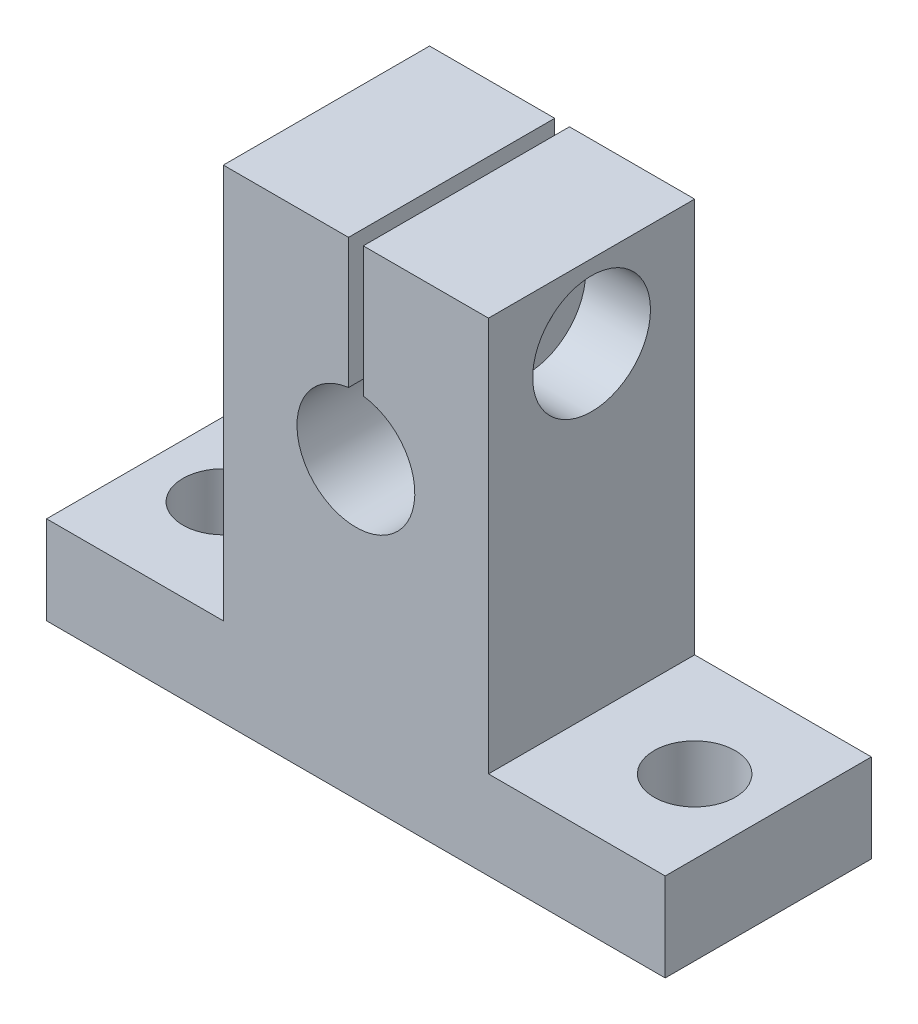
ISO-10303-21;
HEADER;
FILE_DESCRIPTION(('STEP AP214'),'2;1');
FILE_NAME('part.step','',(''),(''),'','','');
FILE_SCHEMA(('AUTOMOTIVE_DESIGN { 1 0 10303 214 1 1 1 1 }'));
ENDSEC;
DATA;
#1=APPLICATION_CONTEXT('core data for automotive mechanical design processes');
#2=APPLICATION_PROTOCOL_DEFINITION('international standard','automotive_design',2000,#1);
#3=PRODUCT_CONTEXT('',#1,'mechanical');
#4=PRODUCT('Part','Part','',(#3));
#5=PRODUCT_RELATED_PRODUCT_CATEGORY('part','',(#4));
#6=PRODUCT_DEFINITION_FORMATION('','',#4);
#7=PRODUCT_DEFINITION_CONTEXT('part definition',#1,'design');
#8=PRODUCT_DEFINITION('design','',#6,#7);
#9=PRODUCT_DEFINITION_SHAPE('','',#8);
#10=(LENGTH_UNIT() NAMED_UNIT(*) SI_UNIT(.MILLI.,.METRE.));
#11=(NAMED_UNIT(*) PLANE_ANGLE_UNIT() SI_UNIT($,.RADIAN.));
#12=(NAMED_UNIT(*) SI_UNIT($,.STERADIAN.) SOLID_ANGLE_UNIT());
#13=UNCERTAINTY_MEASURE_WITH_UNIT(LENGTH_MEASURE(1.E-05),#10,'distance_accuracy_value','');
#14=(GEOMETRIC_REPRESENTATION_CONTEXT(3) GLOBAL_UNCERTAINTY_ASSIGNED_CONTEXT((#13)) GLOBAL_UNIT_ASSIGNED_CONTEXT((#10,
#11,#12)) REPRESENTATION_CONTEXT('',''));
#15=CARTESIAN_POINT('',(0.,0.,0.));
#16=DIRECTION('',(0.,0.,1.));
#17=DIRECTION('',(1.,0.,0.));
#18=AXIS2_PLACEMENT_3D('',#15,#16,#17);
#19=CARTESIAN_POINT('',(9.,32.8,-7.));
#20=DIRECTION('',(0.,1.,0.));
#21=DIRECTION('',(0.,0.,1.));
#22=AXIS2_PLACEMENT_3D('',#19,#20,#21);
#23=PLANE('',#22);
#24=DIRECTION('',(0.,0.,-1.));
#25=VECTOR('',#24,1.);
#26=CARTESIAN_POINT('',(0.499999999999999,32.8,-7.));
#27=LINE('',#26,#25);
#28=CARTESIAN_POINT('',(0.5,32.8,7.));
#29=VERTEX_POINT('',#28);
#30=CARTESIAN_POINT('',(0.5,32.8,-7.));
#31=VERTEX_POINT('',#30);
#32=EDGE_CURVE('E245',#29,#31,#27,.T.);
#33=ORIENTED_EDGE('',*,*,#32,.F.);
#34=DIRECTION('',(-1.,0.,0.));
#35=VECTOR('',#34,1.);
#36=CARTESIAN_POINT('',(9.,32.8,7.));
#37=LINE('',#36,#35);
#38=CARTESIAN_POINT('',(9.,32.8,7.));
#39=VERTEX_POINT('',#38);
#40=EDGE_CURVE('E163',#39,#29,#37,.T.);
#41=ORIENTED_EDGE('',*,*,#40,.F.);
#42=DIRECTION('',(0.,0.,1.));
#43=VECTOR('',#42,1.);
#44=CARTESIAN_POINT('',(9.,32.8,-7.));
#45=LINE('',#44,#43);
#46=CARTESIAN_POINT('',(9.,32.8,-7.));
#47=VERTEX_POINT('',#46);
#48=EDGE_CURVE('E204',#47,#39,#45,.T.);
#49=ORIENTED_EDGE('',*,*,#48,.F.);
#50=DIRECTION('',(-1.,0.,0.));
#51=VECTOR('',#50,1.);
#52=CARTESIAN_POINT('',(9.,32.8,-7.));
#53=LINE('',#52,#51);
#54=EDGE_CURVE('E188',#47,#31,#53,.T.);
#55=ORIENTED_EDGE('',*,*,#54,.T.);
#56=EDGE_LOOP('',(#33,#41,#49,#55));
#57=FACE_BOUND('',#56,.T.);
#58=ADVANCED_FACE('F34',(#57),#23,.T.);
#59=CARTESIAN_POINT('',(-21.,6.,-7.));
#60=DIRECTION('',(-1.,0.,0.));
#61=DIRECTION('',(0.,0.,1.));
#62=AXIS2_PLACEMENT_3D('',#59,#60,#61);
#63=PLANE('',#62);
#64=DIRECTION('',(0.,0.,1.));
#65=VECTOR('',#64,1.);
#66=CARTESIAN_POINT('',(-21.,0.,-7.));
#67=LINE('',#66,#65);
#68=CARTESIAN_POINT('',(-21.,0.,-7.));
#69=VERTEX_POINT('',#68);
#70=CARTESIAN_POINT('',(-21.,0.,7.));
#71=VERTEX_POINT('',#70);
#72=EDGE_CURVE('E197',#69,#71,#67,.T.);
#73=ORIENTED_EDGE('',*,*,#72,.T.);
#74=DIRECTION('',(0.,-1.,0.));
#75=VECTOR('',#74,1.);
#76=CARTESIAN_POINT('',(-21.,6.,7.));
#77=LINE('',#76,#75);
#78=CARTESIAN_POINT('',(-21.,6.,7.));
#79=VERTEX_POINT('',#78);
#80=EDGE_CURVE('E140',#79,#71,#77,.T.);
#81=ORIENTED_EDGE('',*,*,#80,.F.);
#82=DIRECTION('',(0.,0.,1.));
#83=VECTOR('',#82,1.);
#84=CARTESIAN_POINT('',(-21.,6.,-7.));
#85=LINE('',#84,#83);
#86=CARTESIAN_POINT('',(-21.,6.,-7.));
#87=VERTEX_POINT('',#86);
#88=EDGE_CURVE('E127',#87,#79,#85,.T.);
#89=ORIENTED_EDGE('',*,*,#88,.F.);
#90=DIRECTION('',(0.,-1.,0.));
#91=VECTOR('',#90,1.);
#92=CARTESIAN_POINT('',(-21.,6.,-7.));
#93=LINE('',#92,#91);
#94=EDGE_CURVE('E172',#87,#69,#93,.T.);
#95=ORIENTED_EDGE('',*,*,#94,.T.);
#96=EDGE_LOOP('',(#73,#81,#89,#95));
#97=FACE_BOUND('',#96,.T.);
#98=ADVANCED_FACE('F36',(#97),#63,.T.);
#99=CARTESIAN_POINT('',(-8.99999999999999,6.,-7.));
#100=DIRECTION('',(0.,1.,0.));
#101=DIRECTION('',(-1.,0.,0.));
#102=AXIS2_PLACEMENT_3D('',#99,#100,#101);
#103=PLANE('',#102);
#104=CARTESIAN_POINT('',(-16.,6.,0.));
#105=DIRECTION('',(0.,1.,0.));
#106=DIRECTION('',(-1.,0.,0.));
#107=AXIS2_PLACEMENT_3D('',#104,#105,#106);
#108=CIRCLE('',#107,2.75);
#109=CARTESIAN_POINT('',(-18.75,6.,0.));
#110=VERTEX_POINT('',#109);
#111=EDGE_CURVE('E141',#110,#110,#108,.T.);
#112=ORIENTED_EDGE('',*,*,#111,.F.);
#113=EDGE_LOOP('',(#112));
#114=FACE_BOUND('',#113,.T.);
#115=ORIENTED_EDGE('',*,*,#88,.T.);
#116=DIRECTION('',(-1.,0.,0.));
#117=VECTOR('',#116,1.);
#118=CARTESIAN_POINT('',(-8.99999999999999,6.,7.));
#119=LINE('',#118,#117);
#120=CARTESIAN_POINT('',(-8.99999999999999,6.,7.));
#121=VERTEX_POINT('',#120);
#122=EDGE_CURVE('E168',#121,#79,#119,.T.);
#123=ORIENTED_EDGE('',*,*,#122,.F.);
#124=DIRECTION('',(0.,0.,1.));
#125=VECTOR('',#124,1.);
#126=CARTESIAN_POINT('',(-8.99999999999999,6.,-7.));
#127=LINE('',#126,#125);
#128=CARTESIAN_POINT('',(-8.99999999999999,6.,-7.));
#129=VERTEX_POINT('',#128);
#130=EDGE_CURVE('E199',#129,#121,#127,.T.);
#131=ORIENTED_EDGE('',*,*,#130,.F.);
#132=DIRECTION('',(-1.,0.,0.));
#133=VECTOR('',#132,1.);
#134=CARTESIAN_POINT('',(-8.99999999999999,6.,-7.));
#135=LINE('',#134,#133);
#136=EDGE_CURVE('E194',#129,#87,#135,.T.);
#137=ORIENTED_EDGE('',*,*,#136,.T.);
#138=EDGE_LOOP('',(#115,#123,#131,#137));
#139=FACE_BOUND('',#138,.T.);
#140=ADVANCED_FACE('F223',(#114,#139),#103,.T.);
#141=CARTESIAN_POINT('',(-9.,32.8,-7.));
#142=DIRECTION('',(-1.,0.,0.));
#143=DIRECTION('',(0.,-1.,0.));
#144=AXIS2_PLACEMENT_3D('',#141,#142,#143);
#145=PLANE('',#144);
#146=CARTESIAN_POINT('',(-9.,27.8,0.));
#147=DIRECTION('',(-1.,0.,0.));
#148=DIRECTION('',(0.,-1.,0.));
#149=AXIS2_PLACEMENT_3D('',#146,#147,#148);
#150=CIRCLE('',#149,2.25);
#151=CARTESIAN_POINT('',(-9.,25.55,0.));
#152=VERTEX_POINT('',#151);
#153=EDGE_CURVE('E290',#152,#152,#150,.T.);
#154=ORIENTED_EDGE('',*,*,#153,.F.);
#155=EDGE_LOOP('',(#154));
#156=FACE_BOUND('',#155,.T.);
#157=ORIENTED_EDGE('',*,*,#130,.T.);
#158=DIRECTION('',(0.,-1.,0.));
#159=VECTOR('',#158,1.);
#160=CARTESIAN_POINT('',(-9.,32.8,7.));
#161=LINE('',#160,#159);
#162=CARTESIAN_POINT('',(-9.,32.8,7.));
#163=VERTEX_POINT('',#162);
#164=EDGE_CURVE('E165',#163,#121,#161,.T.);
#165=ORIENTED_EDGE('',*,*,#164,.F.);
#166=DIRECTION('',(0.,0.,1.));
#167=VECTOR('',#166,1.);
#168=CARTESIAN_POINT('',(-9.,32.8,-7.));
#169=LINE('',#168,#167);
#170=CARTESIAN_POINT('',(-9.,32.8,-7.));
#171=VERTEX_POINT('',#170);
#172=EDGE_CURVE('E201',#171,#163,#169,.T.);
#173=ORIENTED_EDGE('',*,*,#172,.F.);
#174=DIRECTION('',(0.,-1.,0.));
#175=VECTOR('',#174,1.);
#176=CARTESIAN_POINT('',(-9.,32.8,-7.));
#177=LINE('',#176,#175);
#178=EDGE_CURVE('E191',#171,#129,#177,.T.);
#179=ORIENTED_EDGE('',*,*,#178,.T.);
#180=EDGE_LOOP('',(#157,#165,#173,#179));
#181=FACE_BOUND('',#180,.T.);
#182=ADVANCED_FACE('F278',(#156,#181),#145,.T.);
#183=DIRECTION('',(0.,0.,1.));
#184=VECTOR('',#183,1.);
#185=CARTESIAN_POINT('',(-0.5,32.8,-7.));
#186=LINE('',#185,#184);
#187=CARTESIAN_POINT('',(-0.5,32.8,-7.));
#188=VERTEX_POINT('',#187);
#189=CARTESIAN_POINT('',(-0.499999999999999,32.8,7.));
#190=VERTEX_POINT('',#189);
#191=EDGE_CURVE('E57',#188,#190,#186,.T.);
#192=ORIENTED_EDGE('',*,*,#191,.F.);
#193=EDGE_CURVE('E187',#188,#171,#53,.T.);
#194=ORIENTED_EDGE('',*,*,#193,.T.);
#195=ORIENTED_EDGE('',*,*,#172,.T.);
#196=EDGE_CURVE('E162',#190,#163,#37,.T.);
#197=ORIENTED_EDGE('',*,*,#196,.F.);
#198=EDGE_LOOP('',(#192,#194,#195,#197));
#199=FACE_BOUND('',#198,.T.);
#200=ADVANCED_FACE('F271',(#199),#23,.T.);
#201=CARTESIAN_POINT('',(8.99999999999999,6.,-7.));
#202=DIRECTION('',(1.,0.,0.));
#203=DIRECTION('',(0.,1.,0.));
#204=AXIS2_PLACEMENT_3D('',#201,#202,#203);
#205=PLANE('',#204);
#206=CARTESIAN_POINT('',(9.,27.8,0.));
#207=DIRECTION('',(1.,0.,0.));
#208=DIRECTION('',(0.,0.,-1.));
#209=AXIS2_PLACEMENT_3D('',#206,#207,#208);
#210=CIRCLE('',#209,4.);
#211=CARTESIAN_POINT('',(9.,27.8,-4.));
#212=VERTEX_POINT('',#211);
#213=EDGE_CURVE('E304',#212,#212,#210,.T.);
#214=ORIENTED_EDGE('',*,*,#213,.F.);
#215=EDGE_LOOP('',(#214));
#216=FACE_BOUND('',#215,.T.);
#217=ORIENTED_EDGE('',*,*,#48,.T.);
#218=DIRECTION('',(0.,1.,0.));
#219=VECTOR('',#218,1.);
#220=CARTESIAN_POINT('',(8.99999999999999,6.,7.));
#221=LINE('',#220,#219);
#222=CARTESIAN_POINT('',(8.99999999999999,6.,7.));
#223=VERTEX_POINT('',#222);
#224=EDGE_CURVE('E159',#223,#39,#221,.T.);
#225=ORIENTED_EDGE('',*,*,#224,.F.);
#226=DIRECTION('',(0.,0.,1.));
#227=VECTOR('',#226,1.);
#228=CARTESIAN_POINT('',(8.99999999999999,6.,-7.));
#229=LINE('',#228,#227);
#230=CARTESIAN_POINT('',(8.99999999999999,6.,-7.));
#231=VERTEX_POINT('',#230);
#232=EDGE_CURVE('E206',#231,#223,#229,.T.);
#233=ORIENTED_EDGE('',*,*,#232,.F.);
#234=DIRECTION('',(0.,1.,0.));
#235=VECTOR('',#234,1.);
#236=CARTESIAN_POINT('',(8.99999999999999,6.,-7.));
#237=LINE('',#236,#235);
#238=EDGE_CURVE('E184',#231,#47,#237,.T.);
#239=ORIENTED_EDGE('',*,*,#238,.T.);
#240=EDGE_LOOP('',(#217,#225,#233,#239));
#241=FACE_BOUND('',#240,.T.);
#242=ADVANCED_FACE('F238',(#216,#241),#205,.T.);
#243=CARTESIAN_POINT('',(21.,6.,-7.));
#244=DIRECTION('',(0.,1.,0.));
#245=DIRECTION('',(-1.,0.,0.));
#246=AXIS2_PLACEMENT_3D('',#243,#244,#245);
#247=PLANE('',#246);
#248=CARTESIAN_POINT('',(16.,6.,0.));
#249=DIRECTION('',(0.,1.,0.));
#250=DIRECTION('',(-1.,0.,0.));
#251=AXIS2_PLACEMENT_3D('',#248,#249,#250);
#252=CIRCLE('',#251,2.75);
#253=CARTESIAN_POINT('',(13.25,6.,0.));
#254=VERTEX_POINT('',#253);
#255=EDGE_CURVE('E249',#254,#254,#252,.T.);
#256=ORIENTED_EDGE('',*,*,#255,.F.);
#257=EDGE_LOOP('',(#256));
#258=FACE_BOUND('',#257,.T.);
#259=ORIENTED_EDGE('',*,*,#232,.T.);
#260=DIRECTION('',(-1.,0.,0.));
#261=VECTOR('',#260,1.);
#262=CARTESIAN_POINT('',(21.,6.,7.));
#263=LINE('',#262,#261);
#264=CARTESIAN_POINT('',(21.,6.,7.));
#265=VERTEX_POINT('',#264);
#266=EDGE_CURVE('E156',#265,#223,#263,.T.);
#267=ORIENTED_EDGE('',*,*,#266,.F.);
#268=DIRECTION('',(0.,0.,1.));
#269=VECTOR('',#268,1.);
#270=CARTESIAN_POINT('',(21.,6.,-7.));
#271=LINE('',#270,#269);
#272=CARTESIAN_POINT('',(21.,6.,-7.));
#273=VERTEX_POINT('',#272);
#274=EDGE_CURVE('E208',#273,#265,#271,.T.);
#275=ORIENTED_EDGE('',*,*,#274,.F.);
#276=DIRECTION('',(-1.,0.,0.));
#277=VECTOR('',#276,1.);
#278=CARTESIAN_POINT('',(21.,6.,-7.));
#279=LINE('',#278,#277);
#280=EDGE_CURVE('E181',#273,#231,#279,.T.);
#281=ORIENTED_EDGE('',*,*,#280,.T.);
#282=EDGE_LOOP('',(#259,#267,#275,#281));
#283=FACE_BOUND('',#282,.T.);
#284=ADVANCED_FACE('F236',(#258,#283),#247,.T.);
#285=CARTESIAN_POINT('',(21.,0.,-7.));
#286=DIRECTION('',(1.,0.,0.));
#287=DIRECTION('',(0.,0.,-1.));
#288=AXIS2_PLACEMENT_3D('',#285,#286,#287);
#289=PLANE('',#288);
#290=ORIENTED_EDGE('',*,*,#274,.T.);
#291=DIRECTION('',(0.,1.,0.));
#292=VECTOR('',#291,1.);
#293=CARTESIAN_POINT('',(21.,0.,7.));
#294=LINE('',#293,#292);
#295=CARTESIAN_POINT('',(21.,0.,7.));
#296=VERTEX_POINT('',#295);
#297=EDGE_CURVE('E153',#296,#265,#294,.T.);
#298=ORIENTED_EDGE('',*,*,#297,.F.);
#299=DIRECTION('',(0.,0.,1.));
#300=VECTOR('',#299,1.);
#301=CARTESIAN_POINT('',(21.,0.,-7.));
#302=LINE('',#301,#300);
#303=CARTESIAN_POINT('',(21.,0.,-7.));
#304=VERTEX_POINT('',#303);
#305=EDGE_CURVE('E210',#304,#296,#302,.T.);
#306=ORIENTED_EDGE('',*,*,#305,.F.);
#307=DIRECTION('',(0.,1.,0.));
#308=VECTOR('',#307,1.);
#309=CARTESIAN_POINT('',(21.,0.,-7.));
#310=LINE('',#309,#308);
#311=EDGE_CURVE('E178',#304,#273,#310,.T.);
#312=ORIENTED_EDGE('',*,*,#311,.T.);
#313=EDGE_LOOP('',(#290,#298,#306,#312));
#314=FACE_BOUND('',#313,.T.);
#315=ADVANCED_FACE('F232',(#314),#289,.T.);
#316=CARTESIAN_POINT('',(-21.,0.,-7.));
#317=DIRECTION('',(0.,-1.,0.));
#318=DIRECTION('',(0.,0.,-1.));
#319=AXIS2_PLACEMENT_3D('',#316,#317,#318);
#320=PLANE('',#319);
#321=CARTESIAN_POINT('',(16.,0.,0.));
#322=DIRECTION('',(0.,-1.,0.));
#323=DIRECTION('',(0.,0.,-1.));
#324=AXIS2_PLACEMENT_3D('',#321,#322,#323);
#325=CIRCLE('',#324,2.75);
#326=CARTESIAN_POINT('',(16.,0.,-2.75));
#327=VERTEX_POINT('',#326);
#328=EDGE_CURVE('E246',#327,#327,#325,.T.);
#329=ORIENTED_EDGE('',*,*,#328,.F.);
#330=EDGE_LOOP('',(#329));
#331=FACE_BOUND('',#330,.T.);
#332=CARTESIAN_POINT('',(-16.,0.,0.));
#333=DIRECTION('',(0.,-1.,0.));
#334=DIRECTION('',(0.,0.,-1.));
#335=AXIS2_PLACEMENT_3D('',#332,#333,#334);
#336=CIRCLE('',#335,2.75);
#337=CARTESIAN_POINT('',(-16.,0.,-2.75));
#338=VERTEX_POINT('',#337);
#339=EDGE_CURVE('E147',#338,#338,#336,.T.);
#340=ORIENTED_EDGE('',*,*,#339,.F.);
#341=EDGE_LOOP('',(#340));
#342=FACE_BOUND('',#341,.T.);
#343=ORIENTED_EDGE('',*,*,#305,.T.);
#344=DIRECTION('',(1.,0.,0.));
#345=VECTOR('',#344,1.);
#346=CARTESIAN_POINT('',(-21.,0.,7.));
#347=LINE('',#346,#345);
#348=EDGE_CURVE('E144',#71,#296,#347,.T.);
#349=ORIENTED_EDGE('',*,*,#348,.F.);
#350=ORIENTED_EDGE('',*,*,#72,.F.);
#351=DIRECTION('',(1.,0.,0.));
#352=VECTOR('',#351,1.);
#353=CARTESIAN_POINT('',(-21.,0.,-7.));
#354=LINE('',#353,#352);
#355=EDGE_CURVE('E175',#69,#304,#354,.T.);
#356=ORIENTED_EDGE('',*,*,#355,.T.);
#357=EDGE_LOOP('',(#343,#349,#350,#356));
#358=FACE_BOUND('',#357,.T.);
#359=ADVANCED_FACE('F218',(#331,#342,#358),#320,.T.);
#360=CARTESIAN_POINT('',(0.,0.,-7.));
#361=DIRECTION('',(0.,0.,1.));
#362=DIRECTION('',(1.,0.,0.));
#363=AXIS2_PLACEMENT_3D('',#360,#361,#362);
#364=PLANE('',#363);
#365=CARTESIAN_POINT('',(0.,20.,-7.));
#366=DIRECTION('',(0.,0.,1.));
#367=DIRECTION('',(1.,0.,0.));
#368=AXIS2_PLACEMENT_3D('',#365,#366,#367);
#369=CIRCLE('',#368,4.);
#370=CARTESIAN_POINT('',(-0.499999999999999,23.9686269665969,-7.));
#371=VERTEX_POINT('',#370);
#372=CARTESIAN_POINT('',(0.500000000000001,23.9686269665969,-7.));
#373=VERTEX_POINT('',#372);
#374=EDGE_CURVE('E135',#371,#373,#369,.T.);
#375=ORIENTED_EDGE('',*,*,#374,.T.);
#376=DIRECTION('',(0.,1.,0.));
#377=VECTOR('',#376,1.);
#378=CARTESIAN_POINT('',(0.499999999999999,37.848618060212,-7.));
#379=LINE('',#378,#377);
#380=EDGE_CURVE('E241',#373,#31,#379,.T.);
#381=ORIENTED_EDGE('',*,*,#380,.T.);
#382=ORIENTED_EDGE('',*,*,#54,.F.);
#383=ORIENTED_EDGE('',*,*,#238,.F.);
#384=ORIENTED_EDGE('',*,*,#280,.F.);
#385=ORIENTED_EDGE('',*,*,#311,.F.);
#386=ORIENTED_EDGE('',*,*,#355,.F.);
#387=ORIENTED_EDGE('',*,*,#94,.F.);
#388=ORIENTED_EDGE('',*,*,#136,.F.);
#389=ORIENTED_EDGE('',*,*,#178,.F.);
#390=ORIENTED_EDGE('',*,*,#193,.F.);
#391=DIRECTION('',(0.,-1.,0.));
#392=VECTOR('',#391,1.);
#393=CARTESIAN_POINT('',(-0.500000000000001,37.848618060212,-7.));
#394=LINE('',#393,#392);
#395=EDGE_CURVE('E136',#188,#371,#394,.T.);
#396=ORIENTED_EDGE('',*,*,#395,.T.);
#397=EDGE_LOOP('',(#375,#381,#382,#383,#384,#385,#386,#387,#388,#389,#390,#396));
#398=FACE_BOUND('',#397,.T.);
#399=ADVANCED_FACE('F226',(#398),#364,.F.);
#400=CARTESIAN_POINT('',(0.,20.,-7.));
#401=DIRECTION('',(0.,0.,1.));
#402=DIRECTION('',(1.,0.,0.));
#403=AXIS2_PLACEMENT_3D('',#400,#401,#402);
#404=CYLINDRICAL_SURFACE('',#403,4.);
#405=CARTESIAN_POINT('',(0.,20.,7.));
#406=DIRECTION('',(0.,0.,1.));
#407=DIRECTION('',(1.,0.,0.));
#408=AXIS2_PLACEMENT_3D('',#405,#406,#407);
#409=CIRCLE('',#408,4.);
#410=CARTESIAN_POINT('',(-0.499999999999999,23.9686269665969,7.));
#411=VERTEX_POINT('',#410);
#412=CARTESIAN_POINT('',(0.500000000000001,23.9686269665969,7.));
#413=VERTEX_POINT('',#412);
#414=EDGE_CURVE('E133',#411,#413,#409,.T.);
#415=ORIENTED_EDGE('',*,*,#414,.T.);
#416=DIRECTION('',(0.,0.,1.));
#417=VECTOR('',#416,1.);
#418=CARTESIAN_POINT('',(0.500000000000001,23.9686269665969,-7.));
#419=LINE('',#418,#417);
#420=EDGE_CURVE('E49',#413,#373,#419,.F.);
#421=ORIENTED_EDGE('',*,*,#420,.T.);
#422=ORIENTED_EDGE('',*,*,#374,.F.);
#423=DIRECTION('',(0.,0.,1.));
#424=VECTOR('',#423,1.);
#425=CARTESIAN_POINT('',(-0.499999999999999,23.9686269665969,-7.));
#426=LINE('',#425,#424);
#427=EDGE_CURVE('E122',#371,#411,#426,.T.);
#428=ORIENTED_EDGE('',*,*,#427,.T.);
#429=EDGE_LOOP('',(#415,#421,#422,#428));
#430=FACE_BOUND('',#429,.T.);
#431=ADVANCED_FACE('F132',(#430),#404,.F.);
#432=CARTESIAN_POINT('',(0.,0.,7.));
#433=DIRECTION('',(0.,0.,1.));
#434=DIRECTION('',(1.,0.,0.));
#435=AXIS2_PLACEMENT_3D('',#432,#433,#434);
#436=PLANE('',#435);
#437=DIRECTION('',(0.,1.,0.));
#438=VECTOR('',#437,1.);
#439=CARTESIAN_POINT('',(0.500000000000004,0.,7.));
#440=LINE('',#439,#438);
#441=EDGE_CURVE('E11',#413,#29,#440,.T.);
#442=ORIENTED_EDGE('',*,*,#441,.F.);
#443=ORIENTED_EDGE('',*,*,#414,.F.);
#444=DIRECTION('',(0.,-1.,0.));
#445=VECTOR('',#444,1.);
#446=CARTESIAN_POINT('',(-0.499999999999996,0.,7.));
#447=LINE('',#446,#445);
#448=EDGE_CURVE('E43',#190,#411,#447,.T.);
#449=ORIENTED_EDGE('',*,*,#448,.F.);
#450=ORIENTED_EDGE('',*,*,#196,.T.);
#451=ORIENTED_EDGE('',*,*,#164,.T.);
#452=ORIENTED_EDGE('',*,*,#122,.T.);
#453=ORIENTED_EDGE('',*,*,#80,.T.);
#454=ORIENTED_EDGE('',*,*,#348,.T.);
#455=ORIENTED_EDGE('',*,*,#297,.T.);
#456=ORIENTED_EDGE('',*,*,#266,.T.);
#457=ORIENTED_EDGE('',*,*,#224,.T.);
#458=ORIENTED_EDGE('',*,*,#40,.T.);
#459=EDGE_LOOP('',(#442,#443,#449,#450,#451,#452,#453,#454,#455,#456,#457,#458));
#460=FACE_BOUND('',#459,.T.);
#461=ADVANCED_FACE('F138',(#460),#436,.T.);
#462=CARTESIAN_POINT('',(-16.,0.,0.));
#463=DIRECTION('',(0.,-1.,0.));
#464=DIRECTION('',(0.,0.,-1.));
#465=AXIS2_PLACEMENT_3D('',#462,#463,#464);
#466=CYLINDRICAL_SURFACE('',#465,2.75);
#467=ORIENTED_EDGE('',*,*,#111,.T.);
#468=EDGE_LOOP('',(#467));
#469=FACE_BOUND('',#468,.T.);
#470=ORIENTED_EDGE('',*,*,#339,.T.);
#471=EDGE_LOOP('',(#470));
#472=FACE_BOUND('',#471,.T.);
#473=ADVANCED_FACE('F258',(#469,#472),#466,.F.);
#474=CARTESIAN_POINT('',(16.,0.,0.));
#475=DIRECTION('',(0.,-1.,0.));
#476=DIRECTION('',(0.,0.,-1.));
#477=AXIS2_PLACEMENT_3D('',#474,#475,#476);
#478=CYLINDRICAL_SURFACE('',#477,2.75);
#479=ORIENTED_EDGE('',*,*,#255,.T.);
#480=EDGE_LOOP('',(#479));
#481=FACE_BOUND('',#480,.T.);
#482=ORIENTED_EDGE('',*,*,#328,.T.);
#483=EDGE_LOOP('',(#482));
#484=FACE_BOUND('',#483,.T.);
#485=ADVANCED_FACE('F330',(#481,#484),#478,.F.);
#486=CARTESIAN_POINT('',(-0.500000000000001,37.848618060212,-7.));
#487=DIRECTION('',(-1.,0.,0.));
#488=DIRECTION('',(0.,-1.,0.));
#489=AXIS2_PLACEMENT_3D('',#486,#487,#488);
#490=PLANE('',#489);
#491=CARTESIAN_POINT('',(-0.499999999999999,27.8,0.));
#492=DIRECTION('',(-1.,0.,0.));
#493=DIRECTION('',(0.,-1.,0.));
#494=AXIS2_PLACEMENT_3D('',#491,#492,#493);
#495=CIRCLE('',#494,2.25);
#496=CARTESIAN_POINT('',(-0.499999999999998,25.55,0.));
#497=VERTEX_POINT('',#496);
#498=EDGE_CURVE('E38',#497,#497,#495,.T.);
#499=ORIENTED_EDGE('',*,*,#498,.T.);
#500=EDGE_LOOP('',(#499));
#501=FACE_BOUND('',#500,.T.);
#502=ORIENTED_EDGE('',*,*,#191,.T.);
#503=ORIENTED_EDGE('',*,*,#448,.T.);
#504=ORIENTED_EDGE('',*,*,#427,.F.);
#505=ORIENTED_EDGE('',*,*,#395,.F.);
#506=EDGE_LOOP('',(#502,#503,#504,#505));
#507=FACE_BOUND('',#506,.T.);
#508=ADVANCED_FACE('F121',(#501,#507),#490,.F.);
#509=CARTESIAN_POINT('',(0.499999999999999,37.848618060212,-7.));
#510=DIRECTION('',(1.,0.,0.));
#511=DIRECTION('',(0.,1.,0.));
#512=AXIS2_PLACEMENT_3D('',#509,#510,#511);
#513=PLANE('',#512);
#514=CARTESIAN_POINT('',(0.5,27.8,0.));
#515=DIRECTION('',(1.,0.,0.));
#516=DIRECTION('',(0.,1.,0.));
#517=AXIS2_PLACEMENT_3D('',#514,#515,#516);
#518=CIRCLE('',#517,2.25);
#519=CARTESIAN_POINT('',(0.5,30.05,0.));
#520=VERTEX_POINT('',#519);
#521=EDGE_CURVE('E295',#520,#520,#518,.T.);
#522=ORIENTED_EDGE('',*,*,#521,.T.);
#523=EDGE_LOOP('',(#522));
#524=FACE_BOUND('',#523,.T.);
#525=ORIENTED_EDGE('',*,*,#32,.T.);
#526=ORIENTED_EDGE('',*,*,#380,.F.);
#527=ORIENTED_EDGE('',*,*,#420,.F.);
#528=ORIENTED_EDGE('',*,*,#441,.T.);
#529=EDGE_LOOP('',(#525,#526,#527,#528));
#530=FACE_BOUND('',#529,.T.);
#531=ADVANCED_FACE('F326',(#524,#530),#513,.F.);
#532=CARTESIAN_POINT('',(9.,27.8,0.));
#533=DIRECTION('',(1.,0.,0.));
#534=DIRECTION('',(0.,0.,-1.));
#535=AXIS2_PLACEMENT_3D('',#532,#533,#534);
#536=CYLINDRICAL_SURFACE('',#535,2.25);
#537=CARTESIAN_POINT('',(4.6,27.8,0.));
#538=DIRECTION('',(1.,0.,0.));
#539=DIRECTION('',(0.,0.,-1.));
#540=AXIS2_PLACEMENT_3D('',#537,#538,#539);
#541=CIRCLE('',#540,2.25);
#542=CARTESIAN_POINT('',(4.6,27.8,-2.25));
#543=VERTEX_POINT('',#542);
#544=EDGE_CURVE('E298',#543,#543,#541,.T.);
#545=ORIENTED_EDGE('',*,*,#544,.T.);
#546=EDGE_LOOP('',(#545));
#547=FACE_BOUND('',#546,.T.);
#548=ORIENTED_EDGE('',*,*,#521,.F.);
#549=EDGE_LOOP('',(#548));
#550=FACE_BOUND('',#549,.T.);
#551=ADVANCED_FACE('F320',(#547,#550),#536,.F.);
#552=CARTESIAN_POINT('',(4.6,30.05,0.));
#553=DIRECTION('',(-1.,0.,0.));
#554=DIRECTION('',(0.,0.,1.));
#555=AXIS2_PLACEMENT_3D('',#552,#553,#554);
#556=PLANE('',#555);
#557=ORIENTED_EDGE('',*,*,#544,.F.);
#558=EDGE_LOOP('',(#557));
#559=FACE_BOUND('',#558,.T.);
#560=CARTESIAN_POINT('',(4.6,27.8,0.));
#561=DIRECTION('',(1.,0.,0.));
#562=DIRECTION('',(0.,0.,-1.));
#563=AXIS2_PLACEMENT_3D('',#560,#561,#562);
#564=CIRCLE('',#563,4.);
#565=CARTESIAN_POINT('',(4.6,27.8,-4.));
#566=VERTEX_POINT('',#565);
#567=EDGE_CURVE('E301',#566,#566,#564,.T.);
#568=ORIENTED_EDGE('',*,*,#567,.T.);
#569=EDGE_LOOP('',(#568));
#570=FACE_BOUND('',#569,.T.);
#571=ADVANCED_FACE('F311',(#559,#570),#556,.F.);
#572=CARTESIAN_POINT('',(9.,27.8,0.));
#573=DIRECTION('',(1.,0.,0.));
#574=DIRECTION('',(0.,0.,-1.));
#575=AXIS2_PLACEMENT_3D('',#572,#573,#574);
#576=CYLINDRICAL_SURFACE('',#575,4.);
#577=ORIENTED_EDGE('',*,*,#567,.F.);
#578=EDGE_LOOP('',(#577));
#579=FACE_BOUND('',#578,.T.);
#580=ORIENTED_EDGE('',*,*,#213,.T.);
#581=EDGE_LOOP('',(#580));
#582=FACE_BOUND('',#581,.T.);
#583=ADVANCED_FACE('F308',(#579,#582),#576,.F.);
#584=ORIENTED_EDGE('',*,*,#153,.T.);
#585=EDGE_LOOP('',(#584));
#586=FACE_BOUND('',#585,.T.);
#587=ORIENTED_EDGE('',*,*,#498,.F.);
#588=EDGE_LOOP('',(#587));
#589=FACE_BOUND('',#588,.T.);
#590=ADVANCED_FACE('F310',(#586,#589),#536,.F.);
#591=CLOSED_SHELL('',(#58,#98,#140,#182,#200,#242,#284,#315,#359,#399,#431,#461,#473,#485,#508,
#531,#551,#571,#583,#590));
#592=MANIFOLD_SOLID_BREP('B2',#591);
#593=ADVANCED_BREP_SHAPE_REPRESENTATION('',(#18,#592),#14);
#594=SHAPE_DEFINITION_REPRESENTATION(#9,#593);
ENDSEC;
END-ISO-10303-21;
